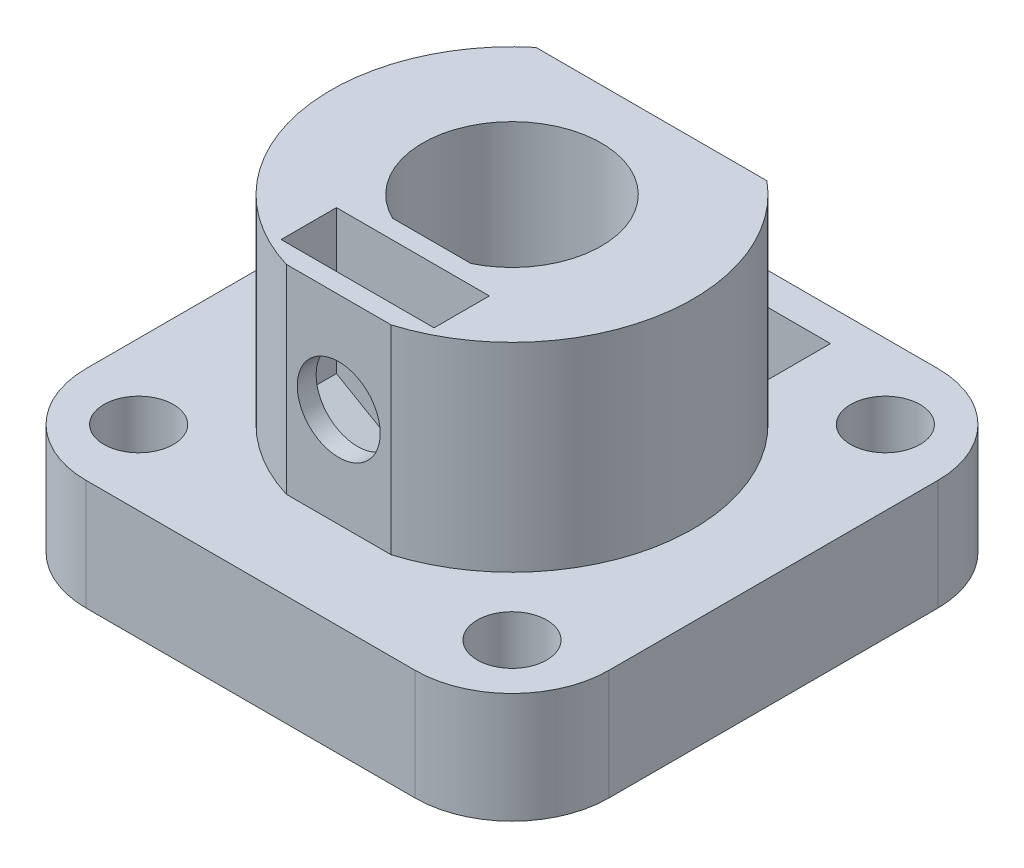
ISO-10303-21;
HEADER;
FILE_DESCRIPTION(('STEP AP214'),'2;1');
FILE_NAME('part.step','',(''),(''),'','','');
FILE_SCHEMA(('AUTOMOTIVE_DESIGN { 1 0 10303 214 1 1 1 1 }'));
ENDSEC;
DATA;
#1=APPLICATION_CONTEXT('core data for automotive mechanical design processes');
#2=APPLICATION_PROTOCOL_DEFINITION('international standard','automotive_design',2000,#1);
#3=PRODUCT_CONTEXT('',#1,'mechanical');
#4=PRODUCT('Part','Part','',(#3));
#5=PRODUCT_RELATED_PRODUCT_CATEGORY('part','',(#4));
#6=PRODUCT_DEFINITION_FORMATION('','',#4);
#7=PRODUCT_DEFINITION_CONTEXT('part definition',#1,'design');
#8=PRODUCT_DEFINITION('design','',#6,#7);
#9=PRODUCT_DEFINITION_SHAPE('','',#8);
#10=(LENGTH_UNIT() NAMED_UNIT(*) SI_UNIT(.MILLI.,.METRE.));
#11=(NAMED_UNIT(*) PLANE_ANGLE_UNIT() SI_UNIT($,.RADIAN.));
#12=(NAMED_UNIT(*) SI_UNIT($,.STERADIAN.) SOLID_ANGLE_UNIT());
#13=UNCERTAINTY_MEASURE_WITH_UNIT(LENGTH_MEASURE(1.E-05),#10,'distance_accuracy_value','');
#14=(GEOMETRIC_REPRESENTATION_CONTEXT(3) GLOBAL_UNCERTAINTY_ASSIGNED_CONTEXT((#13)) GLOBAL_UNIT_ASSIGNED_CONTEXT((#10,
#11,#12)) REPRESENTATION_CONTEXT('',''));
#15=CARTESIAN_POINT('',(0.,0.,0.));
#16=DIRECTION('',(0.,0.,1.));
#17=DIRECTION('',(1.,0.,0.));
#18=AXIS2_PLACEMENT_3D('',#15,#16,#17);
#19=CARTESIAN_POINT('',(0.,11.2,0.));
#20=DIRECTION('',(0.,-1.,0.));
#21=DIRECTION('',(0.,0.,-1.));
#22=AXIS2_PLACEMENT_3D('',#19,#20,#21);
#23=CYLINDRICAL_SURFACE('',#22,6.54594154601839);
#24=CARTESIAN_POINT('',(0.,4.,0.));
#25=DIRECTION('',(0.,1.,0.));
#26=DIRECTION('',(0.,0.,1.));
#27=AXIS2_PLACEMENT_3D('',#24,#25,#26);
#28=CIRCLE('',#27,6.54594154601839);
#29=CARTESIAN_POINT('',(1.89565101016254,4.,6.26544954265529));
#30=VERTEX_POINT('',#29);
#31=CARTESIAN_POINT('',(4.17587152302412,4.,-5.04097686436725));
#32=VERTEX_POINT('',#31);
#33=EDGE_CURVE('E384',#30,#32,#28,.T.);
#34=ORIENTED_EDGE('',*,*,#33,.T.);
#35=DIRECTION('',(0.,1.,0.));
#36=VECTOR('',#35,1.);
#37=CARTESIAN_POINT('',(4.17587152302412,-4.58787586701248,-5.04097686436725));
#38=LINE('',#37,#36);
#39=CARTESIAN_POINT('',(4.17587152302412,11.2,-5.04097686436725));
#40=VERTEX_POINT('',#39);
#41=EDGE_CURVE('E232',#32,#40,#38,.T.);
#42=ORIENTED_EDGE('',*,*,#41,.T.);
#43=CARTESIAN_POINT('',(0.,11.2,0.));
#44=DIRECTION('',(0.,1.,0.));
#45=DIRECTION('',(0.,0.,1.));
#46=AXIS2_PLACEMENT_3D('',#43,#44,#45);
#47=CIRCLE('',#46,6.54594154601839);
#48=CARTESIAN_POINT('',(1.89565101016254,11.2,6.26544954265529));
#49=VERTEX_POINT('',#48);
#50=EDGE_CURVE('E377',#49,#40,#47,.T.);
#51=ORIENTED_EDGE('',*,*,#50,.F.);
#52=DIRECTION('',(0.,-1.,0.));
#53=VECTOR('',#52,1.);
#54=CARTESIAN_POINT('',(1.89565101016254,11.2,6.26544954265529));
#55=LINE('',#54,#53);
#56=EDGE_CURVE('E392',#49,#30,#55,.T.);
#57=ORIENTED_EDGE('',*,*,#56,.T.);
#58=EDGE_LOOP('',(#34,#42,#51,#57));
#59=FACE_BOUND('',#58,.T.);
#60=ADVANCED_FACE('F39',(#59),#23,.T.);
#61=CARTESIAN_POINT('',(0.,7.6,-0.934550457344709));
#62=DIRECTION('',(0.,0.,1.));
#63=DIRECTION('',(1.,0.,0.));
#64=AXIS2_PLACEMENT_3D('',#61,#62,#63);
#65=CYLINDRICAL_SURFACE('',#64,1.5);
#66=CARTESIAN_POINT('',(0.,7.6,6.26544954265529));
#67=DIRECTION('',(0.,0.,1.));
#68=DIRECTION('',(1.,0.,0.));
#69=AXIS2_PLACEMENT_3D('',#66,#67,#68);
#70=CIRCLE('',#69,1.5);
#71=CARTESIAN_POINT('',(1.5,7.6,6.26544954265529));
#72=VERTEX_POINT('',#71);
#73=EDGE_CURVE('E303',#72,#72,#70,.T.);
#74=ORIENTED_EDGE('',*,*,#73,.T.);
#75=EDGE_LOOP('',(#74));
#76=FACE_BOUND('',#75,.T.);
#77=CARTESIAN_POINT('',(0.,7.6,5.58328500792591));
#78=DIRECTION('',(0.,0.,-1.));
#79=DIRECTION('',(-1.,0.,0.));
#80=AXIS2_PLACEMENT_3D('',#77,#78,#79);
#81=CIRCLE('',#80,1.5);
#82=CARTESIAN_POINT('',(-1.5,7.6,5.58328500792591));
#83=VERTEX_POINT('',#82);
#84=EDGE_CURVE('E294',#83,#83,#81,.F.);
#85=ORIENTED_EDGE('',*,*,#84,.F.);
#86=EDGE_LOOP('',(#85));
#87=FACE_BOUND('',#86,.T.);
#88=ADVANCED_FACE('F333',(#76,#87),#65,.F.);
#89=CARTESIAN_POINT('',(1.42,11.2,2.90112047319652));
#90=DIRECTION('',(0.,0.,-1.));
#91=DIRECTION('',(-1.,0.,0.));
#92=AXIS2_PLACEMENT_3D('',#89,#90,#91);
#93=PLANE('',#92);
#94=CARTESIAN_POINT('',(0.,7.6,2.90112047319652));
#95=DIRECTION('',(0.,0.,-1.));
#96=DIRECTION('',(-1.,0.,0.));
#97=AXIS2_PLACEMENT_3D('',#94,#95,#96);
#98=CIRCLE('',#97,1.5);
#99=CARTESIAN_POINT('',(-1.42,8.08332183894379,2.90112047319652));
#100=VERTEX_POINT('',#99);
#101=CARTESIAN_POINT('',(1.42,8.08332183894378,2.90112047319652));
#102=VERTEX_POINT('',#101);
#103=EDGE_CURVE('E520',#100,#102,#98,.T.);
#104=ORIENTED_EDGE('',*,*,#103,.F.);
#105=DIRECTION('',(0.,-1.,0.));
#106=VECTOR('',#105,1.);
#107=CARTESIAN_POINT('',(-1.42,11.2,2.90112047319652));
#108=LINE('',#107,#106);
#109=CARTESIAN_POINT('',(-1.42,11.2,2.90112047319652));
#110=VERTEX_POINT('',#109);
#111=EDGE_CURVE('E388',#110,#100,#108,.T.);
#112=ORIENTED_EDGE('',*,*,#111,.F.);
#113=DIRECTION('',(1.,0.,0.));
#114=VECTOR('',#113,1.);
#115=CARTESIAN_POINT('',(1.42,11.2,2.90112047319652));
#116=LINE('',#115,#114);
#117=CARTESIAN_POINT('',(1.42,11.2,2.90112047319652));
#118=VERTEX_POINT('',#117);
#119=EDGE_CURVE('E547',#110,#118,#116,.T.);
#120=ORIENTED_EDGE('',*,*,#119,.T.);
#121=DIRECTION('',(0.,-1.,0.));
#122=VECTOR('',#121,1.);
#123=CARTESIAN_POINT('',(1.42,11.2,2.90112047319652));
#124=LINE('',#123,#122);
#125=EDGE_CURVE('E541',#118,#102,#124,.T.);
#126=ORIENTED_EDGE('',*,*,#125,.T.);
#127=EDGE_LOOP('',(#104,#112,#120,#126));
#128=FACE_BOUND('',#127,.T.);
#129=ADVANCED_FACE('F339',(#128),#93,.T.);
#130=CARTESIAN_POINT('',(0.,4.,0.));
#131=DIRECTION('',(0.,1.,0.));
#132=DIRECTION('',(0.,0.,1.));
#133=AXIS2_PLACEMENT_3D('',#130,#131,#132);
#134=PLANE('',#133);
#135=DIRECTION('',(0.,0.,1.));
#136=VECTOR('',#135,1.);
#137=CARTESIAN_POINT('',(-2.77599439240195,4.,-5.04097686436725));
#138=LINE('',#137,#136);
#139=CARTESIAN_POINT('',(-2.77599439240195,4.,-8.29166349471677));
#140=VERTEX_POINT('',#139);
#141=CARTESIAN_POINT('',(-2.77599439240195,4.,-5.04097686436725));
#142=VERTEX_POINT('',#141);
#143=EDGE_CURVE('E63',#140,#142,#138,.T.);
#144=ORIENTED_EDGE('',*,*,#143,.F.);
#145=DIRECTION('',(-1.,0.,0.));
#146=VECTOR('',#145,1.);
#147=CARTESIAN_POINT('',(-2.77599439240195,4.,-8.29166349471677));
#148=LINE('',#147,#146);
#149=CARTESIAN_POINT('',(3.22534198532409,4.,-8.29166349471677));
#150=VERTEX_POINT('',#149);
#151=EDGE_CURVE('E227',#150,#140,#148,.T.);
#152=ORIENTED_EDGE('',*,*,#151,.F.);
#153=DIRECTION('',(0.,0.,-1.));
#154=VECTOR('',#153,1.);
#155=CARTESIAN_POINT('',(3.22534198532409,4.,-5.04097686436725));
#156=LINE('',#155,#154);
#157=CARTESIAN_POINT('',(3.22534198532409,4.,-5.04097686436725));
#158=VERTEX_POINT('',#157);
#159=EDGE_CURVE('E210',#158,#150,#156,.T.);
#160=ORIENTED_EDGE('',*,*,#159,.F.);
#161=DIRECTION('',(-1.,0.,0.));
#162=VECTOR('',#161,1.);
#163=CARTESIAN_POINT('',(4.17587152302412,4.,-5.04097686436725));
#164=LINE('',#163,#162);
#165=EDGE_CURVE('E224',#32,#158,#164,.T.);
#166=ORIENTED_EDGE('',*,*,#165,.F.);
#167=ORIENTED_EDGE('',*,*,#33,.F.);
#168=DIRECTION('',(1.,0.,0.));
#169=VECTOR('',#168,1.);
#170=CARTESIAN_POINT('',(1.89565101016254,4.,6.26544954265529));
#171=LINE('',#170,#169);
#172=CARTESIAN_POINT('',(-1.89565101016254,4.,6.26544954265529));
#173=VERTEX_POINT('',#172);
#174=EDGE_CURVE('E378',#173,#30,#171,.T.);
#175=ORIENTED_EDGE('',*,*,#174,.F.);
#176=CARTESIAN_POINT('',(-4.17587152302412,4.,-5.04097686436725));
#177=VERTEX_POINT('',#176);
#178=EDGE_CURVE('E394',#177,#173,#28,.T.);
#179=ORIENTED_EDGE('',*,*,#178,.F.);
#180=EDGE_CURVE('E235',#142,#177,#164,.T.);
#181=ORIENTED_EDGE('',*,*,#180,.F.);
#182=EDGE_LOOP('',(#144,#152,#160,#166,#167,#175,#179,#181));
#183=FACE_BOUND('',#182,.T.);
#184=DIRECTION('',(0.,0.,-1.));
#185=VECTOR('',#184,1.);
#186=CARTESIAN_POINT('',(9.45,4.,0.));
#187=LINE('',#186,#185);
#188=CARTESIAN_POINT('',(9.45,4.,5.95));
#189=VERTEX_POINT('',#188);
#190=CARTESIAN_POINT('',(9.45,4.,-5.95));
#191=VERTEX_POINT('',#190);
#192=EDGE_CURVE('E423',#189,#191,#187,.T.);
#193=ORIENTED_EDGE('',*,*,#192,.T.);
#194=CARTESIAN_POINT('',(5.95,4.,-5.95));
#195=DIRECTION('',(0.,1.,0.));
#196=DIRECTION('',(0.,0.,1.));
#197=AXIS2_PLACEMENT_3D('',#194,#195,#196);
#198=CIRCLE('',#197,3.5);
#199=CARTESIAN_POINT('',(5.95,4.,-9.45));
#200=VERTEX_POINT('',#199);
#201=EDGE_CURVE('E500',#191,#200,#198,.T.);
#202=ORIENTED_EDGE('',*,*,#201,.T.);
#203=DIRECTION('',(1.,0.,0.));
#204=VECTOR('',#203,1.);
#205=CARTESIAN_POINT('',(0.,4.,-9.45));
#206=LINE('',#205,#204);
#207=CARTESIAN_POINT('',(-5.95,4.,-9.45));
#208=VERTEX_POINT('',#207);
#209=EDGE_CURVE('E427',#208,#200,#206,.T.);
#210=ORIENTED_EDGE('',*,*,#209,.F.);
#211=CARTESIAN_POINT('',(-5.95,4.,-5.95));
#212=DIRECTION('',(0.,1.,0.));
#213=DIRECTION('',(0.,0.,1.));
#214=AXIS2_PLACEMENT_3D('',#211,#212,#213);
#215=CIRCLE('',#214,3.5);
#216=CARTESIAN_POINT('',(-9.45,4.,-5.95));
#217=VERTEX_POINT('',#216);
#218=EDGE_CURVE('E491',#208,#217,#215,.T.);
#219=ORIENTED_EDGE('',*,*,#218,.T.);
#220=DIRECTION('',(0.,0.,-1.));
#221=VECTOR('',#220,1.);
#222=CARTESIAN_POINT('',(-9.45,4.,0.));
#223=LINE('',#222,#221);
#224=CARTESIAN_POINT('',(-9.45,4.,5.95));
#225=VERTEX_POINT('',#224);
#226=EDGE_CURVE('E431',#225,#217,#223,.T.);
#227=ORIENTED_EDGE('',*,*,#226,.F.);
#228=CARTESIAN_POINT('',(-5.95,4.,5.95));
#229=DIRECTION('',(0.,1.,0.));
#230=DIRECTION('',(0.,0.,1.));
#231=AXIS2_PLACEMENT_3D('',#228,#229,#230);
#232=CIRCLE('',#231,3.5);
#233=CARTESIAN_POINT('',(-5.95,4.,9.45));
#234=VERTEX_POINT('',#233);
#235=EDGE_CURVE('E494',#225,#234,#232,.T.);
#236=ORIENTED_EDGE('',*,*,#235,.T.);
#237=DIRECTION('',(1.,0.,0.));
#238=VECTOR('',#237,1.);
#239=CARTESIAN_POINT('',(0.,4.,9.45));
#240=LINE('',#239,#238);
#241=CARTESIAN_POINT('',(5.95,4.,9.45));
#242=VERTEX_POINT('',#241);
#243=EDGE_CURVE('E419',#234,#242,#240,.T.);
#244=ORIENTED_EDGE('',*,*,#243,.T.);
#245=CARTESIAN_POINT('',(5.95,4.,5.95));
#246=DIRECTION('',(0.,1.,0.));
#247=DIRECTION('',(0.,0.,1.));
#248=AXIS2_PLACEMENT_3D('',#245,#246,#247);
#249=CIRCLE('',#248,3.5);
#250=EDGE_CURVE('E497',#242,#189,#249,.T.);
#251=ORIENTED_EDGE('',*,*,#250,.T.);
#252=EDGE_LOOP('',(#193,#202,#210,#219,#227,#236,#244,#251));
#253=FACE_BOUND('',#252,.T.);
#254=CARTESIAN_POINT('',(6.75,4.,6.75));
#255=DIRECTION('',(0.,1.,0.));
#256=DIRECTION('',(0.,0.,1.));
#257=AXIS2_PLACEMENT_3D('',#254,#255,#256);
#258=CIRCLE('',#257,1.25514787833992);
#259=CARTESIAN_POINT('',(6.75,4.,8.00514787833992));
#260=VERTEX_POINT('',#259);
#261=EDGE_CURVE('E415',#260,#260,#258,.T.);
#262=ORIENTED_EDGE('',*,*,#261,.F.);
#263=EDGE_LOOP('',(#262));
#264=FACE_BOUND('',#263,.T.);
#265=CARTESIAN_POINT('',(-6.75,4.,6.75));
#266=DIRECTION('',(0.,1.,0.));
#267=DIRECTION('',(0.,0.,1.));
#268=AXIS2_PLACEMENT_3D('',#265,#266,#267);
#269=CIRCLE('',#268,1.25514787833992);
#270=CARTESIAN_POINT('',(-6.75,4.,8.00514787833992));
#271=VERTEX_POINT('',#270);
#272=EDGE_CURVE('E411',#271,#271,#269,.T.);
#273=ORIENTED_EDGE('',*,*,#272,.F.);
#274=EDGE_LOOP('',(#273));
#275=FACE_BOUND('',#274,.T.);
#276=CARTESIAN_POINT('',(6.75,4.,-6.75));
#277=DIRECTION('',(0.,1.,0.));
#278=DIRECTION('',(0.,0.,1.));
#279=AXIS2_PLACEMENT_3D('',#276,#277,#278);
#280=CIRCLE('',#279,1.25514787833992);
#281=CARTESIAN_POINT('',(6.75,4.,-5.49485212166008));
#282=VERTEX_POINT('',#281);
#283=EDGE_CURVE('E406',#282,#282,#280,.T.);
#284=ORIENTED_EDGE('',*,*,#283,.F.);
#285=EDGE_LOOP('',(#284));
#286=FACE_BOUND('',#285,.T.);
#287=CARTESIAN_POINT('',(-6.75,4.,-6.75));
#288=DIRECTION('',(0.,1.,0.));
#289=DIRECTION('',(0.,0.,1.));
#290=AXIS2_PLACEMENT_3D('',#287,#288,#289);
#291=CIRCLE('',#290,1.25514787833992);
#292=CARTESIAN_POINT('',(-6.75,4.,-5.49485212166008));
#293=VERTEX_POINT('',#292);
#294=EDGE_CURVE('E402',#293,#293,#291,.T.);
#295=ORIENTED_EDGE('',*,*,#294,.F.);
#296=EDGE_LOOP('',(#295));
#297=FACE_BOUND('',#296,.T.);
#298=ADVANCED_FACE('F221',(#183,#253,#264,#275,#286,#297),#134,.T.);
#299=CARTESIAN_POINT('',(0.,4.,9.45));
#300=DIRECTION('',(0.,0.,-1.));
#301=DIRECTION('',(-1.,0.,0.));
#302=AXIS2_PLACEMENT_3D('',#299,#300,#301);
#303=PLANE('',#302);
#304=DIRECTION('',(1.,0.,0.));
#305=VECTOR('',#304,1.);
#306=CARTESIAN_POINT('',(0.,0.,9.45));
#307=LINE('',#306,#305);
#308=CARTESIAN_POINT('',(-5.95,0.,9.45));
#309=VERTEX_POINT('',#308);
#310=CARTESIAN_POINT('',(5.95,0.,9.45));
#311=VERTEX_POINT('',#310);
#312=EDGE_CURVE('E451',#309,#311,#307,.T.);
#313=ORIENTED_EDGE('',*,*,#312,.T.);
#314=DIRECTION('',(0.,-1.,0.));
#315=VECTOR('',#314,1.);
#316=CARTESIAN_POINT('',(5.95,4.,9.45));
#317=LINE('',#316,#315);
#318=EDGE_CURVE('E507',#311,#242,#317,.F.);
#319=ORIENTED_EDGE('',*,*,#318,.T.);
#320=ORIENTED_EDGE('',*,*,#243,.F.);
#321=DIRECTION('',(0.,-1.,0.));
#322=VECTOR('',#321,1.);
#323=CARTESIAN_POINT('',(-5.95,0.,9.45));
#324=LINE('',#323,#322);
#325=EDGE_CURVE('E503',#234,#309,#324,.T.);
#326=ORIENTED_EDGE('',*,*,#325,.T.);
#327=EDGE_LOOP('',(#313,#319,#320,#326));
#328=FACE_BOUND('',#327,.T.);
#329=ADVANCED_FACE('F754',(#328),#303,.F.);
#330=CARTESIAN_POINT('',(9.45,4.,0.));
#331=DIRECTION('',(-1.,0.,0.));
#332=DIRECTION('',(0.,0.,1.));
#333=AXIS2_PLACEMENT_3D('',#330,#331,#332);
#334=PLANE('',#333);
#335=DIRECTION('',(0.,0.,-1.));
#336=VECTOR('',#335,1.);
#337=CARTESIAN_POINT('',(9.45,0.,0.));
#338=LINE('',#337,#336);
#339=CARTESIAN_POINT('',(9.45,0.,5.95));
#340=VERTEX_POINT('',#339);
#341=CARTESIAN_POINT('',(9.45,0.,-5.95));
#342=VERTEX_POINT('',#341);
#343=EDGE_CURVE('E455',#340,#342,#338,.T.);
#344=ORIENTED_EDGE('',*,*,#343,.T.);
#345=DIRECTION('',(0.,-1.,0.));
#346=VECTOR('',#345,1.);
#347=CARTESIAN_POINT('',(9.45,4.,-5.95));
#348=LINE('',#347,#346);
#349=EDGE_CURVE('E488',#342,#191,#348,.F.);
#350=ORIENTED_EDGE('',*,*,#349,.T.);
#351=ORIENTED_EDGE('',*,*,#192,.F.);
#352=DIRECTION('',(0.,-1.,0.));
#353=VECTOR('',#352,1.);
#354=CARTESIAN_POINT('',(9.45,4.,5.95));
#355=LINE('',#354,#353);
#356=EDGE_CURVE('E484',#189,#340,#355,.T.);
#357=ORIENTED_EDGE('',*,*,#356,.T.);
#358=EDGE_LOOP('',(#344,#350,#351,#357));
#359=FACE_BOUND('',#358,.T.);
#360=ADVANCED_FACE('F742',(#359),#334,.F.);
#361=CARTESIAN_POINT('',(0.,4.,-9.45));
#362=DIRECTION('',(0.,0.,-1.));
#363=DIRECTION('',(-1.,0.,0.));
#364=AXIS2_PLACEMENT_3D('',#361,#362,#363);
#365=PLANE('',#364);
#366=ORIENTED_EDGE('',*,*,#209,.T.);
#367=DIRECTION('',(0.,-1.,0.));
#368=VECTOR('',#367,1.);
#369=CARTESIAN_POINT('',(5.95,0.,-9.45));
#370=LINE('',#369,#368);
#371=CARTESIAN_POINT('',(5.95,0.,-9.45));
#372=VERTEX_POINT('',#371);
#373=EDGE_CURVE('E468',#200,#372,#370,.T.);
#374=ORIENTED_EDGE('',*,*,#373,.T.);
#375=DIRECTION('',(1.,0.,0.));
#376=VECTOR('',#375,1.);
#377=CARTESIAN_POINT('',(0.,0.,-9.45));
#378=LINE('',#377,#376);
#379=CARTESIAN_POINT('',(-5.95,0.,-9.45));
#380=VERTEX_POINT('',#379);
#381=EDGE_CURVE('E459',#380,#372,#378,.T.);
#382=ORIENTED_EDGE('',*,*,#381,.F.);
#383=DIRECTION('',(0.,-1.,0.));
#384=VECTOR('',#383,1.);
#385=CARTESIAN_POINT('',(-5.95,4.,-9.45));
#386=LINE('',#385,#384);
#387=EDGE_CURVE('E435',#380,#208,#386,.F.);
#388=ORIENTED_EDGE('',*,*,#387,.T.);
#389=EDGE_LOOP('',(#366,#374,#382,#388));
#390=FACE_BOUND('',#389,.T.);
#391=ADVANCED_FACE('F736',(#390),#365,.T.);
#392=CARTESIAN_POINT('',(6.75,4.,6.75));
#393=DIRECTION('',(0.,-1.,0.));
#394=DIRECTION('',(0.,0.,-1.));
#395=AXIS2_PLACEMENT_3D('',#392,#393,#394);
#396=CYLINDRICAL_SURFACE('',#395,1.25514787833992);
#397=ORIENTED_EDGE('',*,*,#261,.T.);
#398=EDGE_LOOP('',(#397));
#399=FACE_BOUND('',#398,.T.);
#400=CARTESIAN_POINT('',(6.75,0.,6.75));
#401=DIRECTION('',(0.,1.,0.));
#402=DIRECTION('',(0.,0.,1.));
#403=AXIS2_PLACEMENT_3D('',#400,#401,#402);
#404=CIRCLE('',#403,1.25514787833992);
#405=CARTESIAN_POINT('',(6.75,0.,8.00514787833992));
#406=VERTEX_POINT('',#405);
#407=EDGE_CURVE('E447',#406,#406,#404,.T.);
#408=ORIENTED_EDGE('',*,*,#407,.F.);
#409=EDGE_LOOP('',(#408));
#410=FACE_BOUND('',#409,.T.);
#411=ADVANCED_FACE('F741',(#399,#410),#396,.F.);
#412=CARTESIAN_POINT('',(-6.75,4.,6.75));
#413=DIRECTION('',(0.,-1.,0.));
#414=DIRECTION('',(0.,0.,-1.));
#415=AXIS2_PLACEMENT_3D('',#412,#413,#414);
#416=CYLINDRICAL_SURFACE('',#415,1.25514787833992);
#417=ORIENTED_EDGE('',*,*,#272,.T.);
#418=EDGE_LOOP('',(#417));
#419=FACE_BOUND('',#418,.T.);
#420=CARTESIAN_POINT('',(-6.75,0.,6.75));
#421=DIRECTION('',(0.,1.,0.));
#422=DIRECTION('',(0.,0.,1.));
#423=AXIS2_PLACEMENT_3D('',#420,#421,#422);
#424=CIRCLE('',#423,1.25514787833992);
#425=CARTESIAN_POINT('',(-6.75,0.,8.00514787833992));
#426=VERTEX_POINT('',#425);
#427=EDGE_CURVE('E443',#426,#426,#424,.T.);
#428=ORIENTED_EDGE('',*,*,#427,.F.);
#429=EDGE_LOOP('',(#428));
#430=FACE_BOUND('',#429,.T.);
#431=ADVANCED_FACE('F781',(#419,#430),#416,.F.);
#432=CARTESIAN_POINT('',(6.75,4.,-6.75));
#433=DIRECTION('',(0.,-1.,0.));
#434=DIRECTION('',(0.,0.,-1.));
#435=AXIS2_PLACEMENT_3D('',#432,#433,#434);
#436=CYLINDRICAL_SURFACE('',#435,1.25514787833992);
#437=ORIENTED_EDGE('',*,*,#283,.T.);
#438=EDGE_LOOP('',(#437));
#439=FACE_BOUND('',#438,.T.);
#440=CARTESIAN_POINT('',(6.75,0.,-6.75));
#441=DIRECTION('',(0.,1.,0.));
#442=DIRECTION('',(0.,0.,1.));
#443=AXIS2_PLACEMENT_3D('',#440,#441,#442);
#444=CIRCLE('',#443,1.25514787833992);
#445=CARTESIAN_POINT('',(6.75,0.,-5.49485212166008));
#446=VERTEX_POINT('',#445);
#447=EDGE_CURVE('E439',#446,#446,#444,.T.);
#448=ORIENTED_EDGE('',*,*,#447,.F.);
#449=EDGE_LOOP('',(#448));
#450=FACE_BOUND('',#449,.T.);
#451=ADVANCED_FACE('F771',(#439,#450),#436,.F.);
#452=CARTESIAN_POINT('',(-6.75,4.,-6.75));
#453=DIRECTION('',(0.,-1.,0.));
#454=DIRECTION('',(0.,0.,-1.));
#455=AXIS2_PLACEMENT_3D('',#452,#453,#454);
#456=CYLINDRICAL_SURFACE('',#455,1.25514787833992);
#457=ORIENTED_EDGE('',*,*,#294,.T.);
#458=EDGE_LOOP('',(#457));
#459=FACE_BOUND('',#458,.T.);
#460=CARTESIAN_POINT('',(-6.75,0.,-6.75));
#461=DIRECTION('',(0.,1.,0.));
#462=DIRECTION('',(0.,0.,1.));
#463=AXIS2_PLACEMENT_3D('',#460,#461,#462);
#464=CIRCLE('',#463,1.25514787833992);
#465=CARTESIAN_POINT('',(-6.75,0.,-5.49485212166008));
#466=VERTEX_POINT('',#465);
#467=EDGE_CURVE('E401',#466,#466,#464,.T.);
#468=ORIENTED_EDGE('',*,*,#467,.F.);
#469=EDGE_LOOP('',(#468));
#470=FACE_BOUND('',#469,.T.);
#471=ADVANCED_FACE('F727',(#459,#470),#456,.F.);
#472=CARTESIAN_POINT('',(-9.45,4.,0.));
#473=DIRECTION('',(-1.,0.,0.));
#474=DIRECTION('',(0.,0.,1.));
#475=AXIS2_PLACEMENT_3D('',#472,#473,#474);
#476=PLANE('',#475);
#477=DIRECTION('',(0.,0.,-1.));
#478=VECTOR('',#477,1.);
#479=CARTESIAN_POINT('',(-9.45,0.,0.));
#480=LINE('',#479,#478);
#481=CARTESIAN_POINT('',(-9.45,0.,5.95));
#482=VERTEX_POINT('',#481);
#483=CARTESIAN_POINT('',(-9.45,0.,-5.95));
#484=VERTEX_POINT('',#483);
#485=EDGE_CURVE('E407',#482,#484,#480,.T.);
#486=ORIENTED_EDGE('',*,*,#485,.F.);
#487=DIRECTION('',(0.,-1.,0.));
#488=VECTOR('',#487,1.);
#489=CARTESIAN_POINT('',(-9.45,4.,5.95));
#490=LINE('',#489,#488);
#491=EDGE_CURVE('E514',#482,#225,#490,.F.);
#492=ORIENTED_EDGE('',*,*,#491,.T.);
#493=ORIENTED_EDGE('',*,*,#226,.T.);
#494=DIRECTION('',(0.,-1.,0.));
#495=VECTOR('',#494,1.);
#496=CARTESIAN_POINT('',(-9.45,4.,-5.95));
#497=LINE('',#496,#495);
#498=EDGE_CURVE('E510',#217,#484,#497,.T.);
#499=ORIENTED_EDGE('',*,*,#498,.T.);
#500=EDGE_LOOP('',(#486,#492,#493,#499));
#501=FACE_BOUND('',#500,.T.);
#502=ADVANCED_FACE('F722',(#501),#476,.T.);
#503=CARTESIAN_POINT('',(0.,0.,0.));
#504=DIRECTION('',(0.,1.,0.));
#505=DIRECTION('',(0.,0.,1.));
#506=AXIS2_PLACEMENT_3D('',#503,#504,#505);
#507=PLANE('',#506);
#508=DIRECTION('',(1.,0.,0.));
#509=VECTOR('',#508,1.);
#510=CARTESIAN_POINT('',(-2.77599439240195,0.,-8.29166349471677));
#511=LINE('',#510,#509);
#512=CARTESIAN_POINT('',(-2.77599439240195,0.,-8.29166349471677));
#513=VERTEX_POINT('',#512);
#514=CARTESIAN_POINT('',(3.22534198532409,0.,-8.29166349471677));
#515=VERTEX_POINT('',#514);
#516=EDGE_CURVE('E579',#513,#515,#511,.T.);
#517=ORIENTED_EDGE('',*,*,#516,.F.);
#518=DIRECTION('',(0.,0.,-1.));
#519=VECTOR('',#518,1.);
#520=CARTESIAN_POINT('',(-2.77599439240195,0.,-5.04097686436725));
#521=LINE('',#520,#519);
#522=CARTESIAN_POINT('',(-2.77599439240195,0.,-5.04097686436725));
#523=VERTEX_POINT('',#522);
#524=EDGE_CURVE('E567',#523,#513,#521,.T.);
#525=ORIENTED_EDGE('',*,*,#524,.F.);
#526=DIRECTION('',(-1.,0.,0.));
#527=VECTOR('',#526,1.);
#528=CARTESIAN_POINT('',(-2.77599439240195,0.,-5.04097686436725));
#529=LINE('',#528,#527);
#530=CARTESIAN_POINT('',(3.22534198532409,0.,-5.04097686436725));
#531=VERTEX_POINT('',#530);
#532=EDGE_CURVE('E244',#531,#523,#529,.T.);
#533=ORIENTED_EDGE('',*,*,#532,.F.);
#534=DIRECTION('',(0.,0.,1.));
#535=VECTOR('',#534,1.);
#536=CARTESIAN_POINT('',(3.22534198532409,0.,-5.04097686436725));
#537=LINE('',#536,#535);
#538=EDGE_CURVE('E213',#515,#531,#537,.T.);
#539=ORIENTED_EDGE('',*,*,#538,.F.);
#540=EDGE_LOOP('',(#517,#525,#533,#539));
#541=FACE_BOUND('',#540,.T.);
#542=DIRECTION('',(-1.,0.,0.));
#543=VECTOR('',#542,1.);
#544=CARTESIAN_POINT('',(-1.42,0.,2.90112047319652));
#545=LINE('',#544,#543);
#546=CARTESIAN_POINT('',(1.42,0.,2.90112047319652));
#547=VERTEX_POINT('',#546);
#548=CARTESIAN_POINT('',(-1.42,0.,2.90112047319652));
#549=VERTEX_POINT('',#548);
#550=EDGE_CURVE('E240',#547,#549,#545,.T.);
#551=ORIENTED_EDGE('',*,*,#550,.F.);
#552=CARTESIAN_POINT('',(0.,0.,0.));
#553=DIRECTION('',(0.,1.,0.));
#554=DIRECTION('',(0.,0.,1.));
#555=AXIS2_PLACEMENT_3D('',#552,#553,#554);
#556=CIRCLE('',#555,3.23);
#557=EDGE_CURVE('E234',#549,#547,#556,.F.);
#558=ORIENTED_EDGE('',*,*,#557,.F.);
#559=EDGE_LOOP('',(#551,#558));
#560=FACE_BOUND('',#559,.T.);
#561=ORIENTED_EDGE('',*,*,#467,.T.);
#562=EDGE_LOOP('',(#561));
#563=FACE_BOUND('',#562,.T.);
#564=ORIENTED_EDGE('',*,*,#447,.T.);
#565=EDGE_LOOP('',(#564));
#566=FACE_BOUND('',#565,.T.);
#567=ORIENTED_EDGE('',*,*,#427,.T.);
#568=EDGE_LOOP('',(#567));
#569=FACE_BOUND('',#568,.T.);
#570=ORIENTED_EDGE('',*,*,#407,.T.);
#571=EDGE_LOOP('',(#570));
#572=FACE_BOUND('',#571,.T.);
#573=ORIENTED_EDGE('',*,*,#381,.T.);
#574=CARTESIAN_POINT('',(5.95,0.,-5.95));
#575=DIRECTION('',(0.,1.,0.));
#576=DIRECTION('',(0.,0.,1.));
#577=AXIS2_PLACEMENT_3D('',#574,#575,#576);
#578=CIRCLE('',#577,3.5);
#579=EDGE_CURVE('E481',#372,#342,#578,.F.);
#580=ORIENTED_EDGE('',*,*,#579,.T.);
#581=ORIENTED_EDGE('',*,*,#343,.F.);
#582=CARTESIAN_POINT('',(5.95,0.,5.95));
#583=DIRECTION('',(0.,1.,0.));
#584=DIRECTION('',(0.,0.,1.));
#585=AXIS2_PLACEMENT_3D('',#582,#583,#584);
#586=CIRCLE('',#585,3.5);
#587=EDGE_CURVE('E478',#340,#311,#586,.F.);
#588=ORIENTED_EDGE('',*,*,#587,.T.);
#589=ORIENTED_EDGE('',*,*,#312,.F.);
#590=CARTESIAN_POINT('',(-5.95,0.,5.95));
#591=DIRECTION('',(0.,1.,0.));
#592=DIRECTION('',(0.,0.,1.));
#593=AXIS2_PLACEMENT_3D('',#590,#591,#592);
#594=CIRCLE('',#593,3.5);
#595=EDGE_CURVE('E475',#309,#482,#594,.F.);
#596=ORIENTED_EDGE('',*,*,#595,.T.);
#597=ORIENTED_EDGE('',*,*,#485,.T.);
#598=CARTESIAN_POINT('',(-5.95,0.,-5.95));
#599=DIRECTION('',(0.,1.,0.));
#600=DIRECTION('',(0.,0.,1.));
#601=AXIS2_PLACEMENT_3D('',#598,#599,#600);
#602=CIRCLE('',#601,3.5);
#603=EDGE_CURVE('E472',#484,#380,#602,.F.);
#604=ORIENTED_EDGE('',*,*,#603,.T.);
#605=EDGE_LOOP('',(#573,#580,#581,#588,#589,#596,#597,#604));
#606=FACE_BOUND('',#605,.T.);
#607=ADVANCED_FACE('F588',(#541,#560,#563,#566,#569,#572,#606),#507,.F.);
#608=CARTESIAN_POINT('',(5.95,4.,-5.95));
#609=DIRECTION('',(0.,1.,0.));
#610=DIRECTION('',(0.,0.,1.));
#611=AXIS2_PLACEMENT_3D('',#608,#609,#610);
#612=CYLINDRICAL_SURFACE('',#611,3.5);
#613=ORIENTED_EDGE('',*,*,#201,.F.);
#614=ORIENTED_EDGE('',*,*,#349,.F.);
#615=ORIENTED_EDGE('',*,*,#579,.F.);
#616=ORIENTED_EDGE('',*,*,#373,.F.);
#617=EDGE_LOOP('',(#613,#614,#615,#616));
#618=FACE_BOUND('',#617,.T.);
#619=ADVANCED_FACE('F705',(#618),#612,.T.);
#620=CARTESIAN_POINT('',(5.95,4.,5.95));
#621=DIRECTION('',(0.,-1.,0.));
#622=DIRECTION('',(0.,0.,-1.));
#623=AXIS2_PLACEMENT_3D('',#620,#621,#622);
#624=CYLINDRICAL_SURFACE('',#623,3.5);
#625=ORIENTED_EDGE('',*,*,#250,.F.);
#626=ORIENTED_EDGE('',*,*,#318,.F.);
#627=ORIENTED_EDGE('',*,*,#587,.F.);
#628=ORIENTED_EDGE('',*,*,#356,.F.);
#629=EDGE_LOOP('',(#625,#626,#627,#628));
#630=FACE_BOUND('',#629,.T.);
#631=ADVANCED_FACE('F696',(#630),#624,.T.);
#632=CARTESIAN_POINT('',(-5.95,4.,5.95));
#633=DIRECTION('',(0.,1.,0.));
#634=DIRECTION('',(0.,0.,1.));
#635=AXIS2_PLACEMENT_3D('',#632,#633,#634);
#636=CYLINDRICAL_SURFACE('',#635,3.5);
#637=ORIENTED_EDGE('',*,*,#235,.F.);
#638=ORIENTED_EDGE('',*,*,#491,.F.);
#639=ORIENTED_EDGE('',*,*,#595,.F.);
#640=ORIENTED_EDGE('',*,*,#325,.F.);
#641=EDGE_LOOP('',(#637,#638,#639,#640));
#642=FACE_BOUND('',#641,.T.);
#643=ADVANCED_FACE('F686',(#642),#636,.T.);
#644=CARTESIAN_POINT('',(-5.95,4.,-5.95));
#645=DIRECTION('',(0.,-1.,0.));
#646=DIRECTION('',(0.,0.,-1.));
#647=AXIS2_PLACEMENT_3D('',#644,#645,#646);
#648=CYLINDRICAL_SURFACE('',#647,3.5);
#649=ORIENTED_EDGE('',*,*,#218,.F.);
#650=ORIENTED_EDGE('',*,*,#387,.F.);
#651=ORIENTED_EDGE('',*,*,#603,.F.);
#652=ORIENTED_EDGE('',*,*,#498,.F.);
#653=EDGE_LOOP('',(#649,#650,#651,#652));
#654=FACE_BOUND('',#653,.T.);
#655=ADVANCED_FACE('F41',(#654),#648,.T.);
#656=CARTESIAN_POINT('',(0.,11.2,0.));
#657=DIRECTION('',(0.,1.,0.));
#658=DIRECTION('',(0.,0.,1.));
#659=AXIS2_PLACEMENT_3D('',#656,#657,#658);
#660=PLANE('',#659);
#661=DIRECTION('',(1.,0.,0.));
#662=VECTOR('',#661,1.);
#663=CARTESIAN_POINT('',(4.17587152302412,11.2,-5.04097686436725));
#664=LINE('',#663,#662);
#665=CARTESIAN_POINT('',(-4.17587152302412,11.2,-5.04097686436725));
#666=VERTEX_POINT('',#665);
#667=EDGE_CURVE('E246',#666,#40,#664,.T.);
#668=ORIENTED_EDGE('',*,*,#667,.F.);
#669=CARTESIAN_POINT('',(-1.89565101016254,11.2,6.26544954265529));
#670=VERTEX_POINT('',#669);
#671=EDGE_CURVE('E370',#666,#670,#47,.T.);
#672=ORIENTED_EDGE('',*,*,#671,.T.);
#673=DIRECTION('',(1.,0.,0.));
#674=VECTOR('',#673,1.);
#675=CARTESIAN_POINT('',(1.89565101016254,11.2,6.26544954265529));
#676=LINE('',#675,#674);
#677=EDGE_CURVE('E383',#670,#49,#676,.T.);
#678=ORIENTED_EDGE('',*,*,#677,.T.);
#679=ORIENTED_EDGE('',*,*,#50,.T.);
#680=EDGE_LOOP('',(#668,#672,#678,#679));
#681=FACE_BOUND('',#680,.T.);
#682=DIRECTION('',(-1.,0.,0.));
#683=VECTOR('',#682,1.);
#684=CARTESIAN_POINT('',(0.,11.2,3.5832850079259));
#685=LINE('',#684,#683);
#686=CARTESIAN_POINT('',(2.765,11.2,3.5832850079259));
#687=VERTEX_POINT('',#686);
#688=CARTESIAN_POINT('',(-2.765,11.2,3.5832850079259));
#689=VERTEX_POINT('',#688);
#690=EDGE_CURVE('E300',#687,#689,#685,.T.);
#691=ORIENTED_EDGE('',*,*,#690,.F.);
#692=DIRECTION('',(0.,0.,1.));
#693=VECTOR('',#692,1.);
#694=CARTESIAN_POINT('',(2.765,11.2,0.));
#695=LINE('',#694,#693);
#696=CARTESIAN_POINT('',(2.765,11.2,5.58328500792591));
#697=VERTEX_POINT('',#696);
#698=EDGE_CURVE('E11',#687,#697,#695,.T.);
#699=ORIENTED_EDGE('',*,*,#698,.T.);
#700=DIRECTION('',(-1.,0.,0.));
#701=VECTOR('',#700,1.);
#702=CARTESIAN_POINT('',(0.,11.2,5.58328500792591));
#703=LINE('',#702,#701);
#704=CARTESIAN_POINT('',(-2.765,11.2,5.58328500792591));
#705=VERTEX_POINT('',#704);
#706=EDGE_CURVE('E295',#697,#705,#703,.T.);
#707=ORIENTED_EDGE('',*,*,#706,.T.);
#708=DIRECTION('',(0.,0.,-1.));
#709=VECTOR('',#708,1.);
#710=CARTESIAN_POINT('',(-2.765,11.2,0.));
#711=LINE('',#710,#709);
#712=EDGE_CURVE('E48',#705,#689,#711,.T.);
#713=ORIENTED_EDGE('',*,*,#712,.T.);
#714=EDGE_LOOP('',(#691,#699,#707,#713));
#715=FACE_BOUND('',#714,.T.);
#716=ORIENTED_EDGE('',*,*,#119,.F.);
#717=CARTESIAN_POINT('',(0.,11.2,0.));
#718=DIRECTION('',(0.,1.,0.));
#719=DIRECTION('',(0.,0.,1.));
#720=AXIS2_PLACEMENT_3D('',#717,#718,#719);
#721=CIRCLE('',#720,3.23);
#722=EDGE_CURVE('E545',#118,#110,#721,.T.);
#723=ORIENTED_EDGE('',*,*,#722,.F.);
#724=EDGE_LOOP('',(#716,#723));
#725=FACE_BOUND('',#724,.T.);
#726=ADVANCED_FACE('F359',(#681,#715,#725),#660,.T.);
#727=ORIENTED_EDGE('',*,*,#671,.F.);
#728=DIRECTION('',(0.,1.,0.));
#729=VECTOR('',#728,1.);
#730=CARTESIAN_POINT('',(-4.17587152302412,-4.58787586701248,-5.04097686436725));
#731=LINE('',#730,#729);
#732=EDGE_CURVE('E249',#177,#666,#731,.T.);
#733=ORIENTED_EDGE('',*,*,#732,.F.);
#734=ORIENTED_EDGE('',*,*,#178,.T.);
#735=DIRECTION('',(0.,-1.,0.));
#736=VECTOR('',#735,1.);
#737=CARTESIAN_POINT('',(-1.89565101016254,11.2,6.26544954265529));
#738=LINE('',#737,#736);
#739=EDGE_CURVE('E373',#670,#173,#738,.T.);
#740=ORIENTED_EDGE('',*,*,#739,.F.);
#741=EDGE_LOOP('',(#727,#733,#734,#740));
#742=FACE_BOUND('',#741,.T.);
#743=ADVANCED_FACE('F351',(#742),#23,.T.);
#744=CARTESIAN_POINT('',(1.89565101016254,11.2,6.26544954265529));
#745=DIRECTION('',(0.,0.,-1.));
#746=DIRECTION('',(-1.,0.,0.));
#747=AXIS2_PLACEMENT_3D('',#744,#745,#746);
#748=PLANE('',#747);
#749=ORIENTED_EDGE('',*,*,#73,.F.);
#750=EDGE_LOOP('',(#749));
#751=FACE_BOUND('',#750,.T.);
#752=ORIENTED_EDGE('',*,*,#174,.T.);
#753=ORIENTED_EDGE('',*,*,#56,.F.);
#754=ORIENTED_EDGE('',*,*,#677,.F.);
#755=ORIENTED_EDGE('',*,*,#739,.T.);
#756=EDGE_LOOP('',(#752,#753,#754,#755));
#757=FACE_BOUND('',#756,.T.);
#758=ADVANCED_FACE('F343',(#751,#757),#748,.F.);
#759=CARTESIAN_POINT('',(0.,11.2,0.));
#760=DIRECTION('',(0.,-1.,0.));
#761=DIRECTION('',(0.,0.,-1.));
#762=AXIS2_PLACEMENT_3D('',#759,#760,#761);
#763=CYLINDRICAL_SURFACE('',#762,3.23);
#764=CARTESIAN_POINT('',(1.42,8.08332183894378,2.90112047319652));
#765=CARTESIAN_POINT('',(1.43213157948199,8.04767784330284,2.89518014795887));
#766=CARTESIAN_POINT('',(1.44294485785123,8.0115057343566,2.88979589573638));
#767=CARTESIAN_POINT('',(1.46184690708239,7.93828410565976,2.88028077762413));
#768=CARTESIAN_POINT('',(1.4699348253028,7.90123431519534,2.87615030402483));
#769=CARTESIAN_POINT('',(1.48995872824324,7.78912506087481,2.8658616381512));
#770=CARTESIAN_POINT('',(1.49767272519207,7.71305344498875,2.8617971684282));
#771=CARTESIAN_POINT('',(1.50142736113948,7.56042269251126,2.85982835786773));
#772=CARTESIAN_POINT('',(1.49744336419859,7.48386286634523,2.86193701759426));
#773=CARTESIAN_POINT('',(1.47796248945501,7.33278340148224,2.8720458916879));
#774=CARTESIAN_POINT('',(1.46249288307817,7.25825936287658,2.88003214989529));
#775=CARTESIAN_POINT('',(1.43498293652646,7.16248899663512,2.8937467810387));
#776=CARTESIAN_POINT('',(1.42776053543634,7.13946471681069,2.89731928530644));
#777=CARTESIAN_POINT('',(1.42,7.11667816105622,2.90112047319653));
#778=B_SPLINE_CURVE_WITH_KNOTS('',3,(#764,#765,#766,#767,#768,#769,#770,#771,#772,#773,#774,
#775,#776,#777),.UNSPECIFIED.,.F.,.F.,(4,2,2,2,2,2,4),(0.,0.114294203453261,0.22862413124871,
0.457118155592093,0.686093732564191,0.914527361759183,0.987669014984168),.UNSPECIFIED.);
#779=CARTESIAN_POINT('',(1.42,7.11667816105621,2.90112047319652));
#780=VERTEX_POINT('',#779);
#781=EDGE_CURVE('E316',#102,#780,#778,.T.);
#782=ORIENTED_EDGE('',*,*,#781,.F.);
#783=ORIENTED_EDGE('',*,*,#125,.F.);
#784=ORIENTED_EDGE('',*,*,#722,.T.);
#785=ORIENTED_EDGE('',*,*,#111,.T.);
#786=CARTESIAN_POINT('',(-1.42,7.11667816105621,2.90112047319652));
#787=CARTESIAN_POINT('',(-1.43213157948198,7.15232215669715,2.89518014795887));
#788=CARTESIAN_POINT('',(-1.44294485785123,7.1884942656434,2.88979589573638));
#789=CARTESIAN_POINT('',(-1.46184690708239,7.26171589434024,2.88028077762414));
#790=CARTESIAN_POINT('',(-1.46993482530279,7.29876568480465,2.87615030402483));
#791=CARTESIAN_POINT('',(-1.48995872824324,7.41087493912519,2.8658616381512));
#792=CARTESIAN_POINT('',(-1.49767272519207,7.48694655501125,2.8617971684282));
#793=CARTESIAN_POINT('',(-1.50142736113948,7.63957730748874,2.85982835786773));
#794=CARTESIAN_POINT('',(-1.49744336419859,7.71613713365477,2.86193701759426));
#795=CARTESIAN_POINT('',(-1.47796248945501,7.86721659851776,2.8720458916879));
#796=CARTESIAN_POINT('',(-1.46249288307817,7.94174063712342,2.88003214989529));
#797=CARTESIAN_POINT('',(-1.43498293652646,8.03751100336488,2.8937467810387));
#798=CARTESIAN_POINT('',(-1.42776053543633,8.06053528318932,2.89731928530644));
#799=CARTESIAN_POINT('',(-1.42,8.08332183894379,2.90112047319653));
#800=B_SPLINE_CURVE_WITH_KNOTS('',3,(#786,#787,#788,#789,#790,#791,#792,#793,#794,#795,#796,
#797,#798,#799),.UNSPECIFIED.,.F.,.F.,(4,2,2,2,2,2,4),(0.,0.114294203453261,0.228624131248709,
0.457118155592093,0.686093732564191,0.914527361759183,0.987669014984175),.UNSPECIFIED.);
#801=CARTESIAN_POINT('',(-1.42,7.11667816105622,2.90112047319652));
#802=VERTEX_POINT('',#801);
#803=EDGE_CURVE('E307',#802,#100,#800,.T.);
#804=ORIENTED_EDGE('',*,*,#803,.F.);
#805=EDGE_CURVE('E549',#802,#549,#108,.T.);
#806=ORIENTED_EDGE('',*,*,#805,.T.);
#807=ORIENTED_EDGE('',*,*,#557,.T.);
#808=EDGE_CURVE('E543',#780,#547,#124,.T.);
#809=ORIENTED_EDGE('',*,*,#808,.F.);
#810=EDGE_LOOP('',(#782,#783,#784,#785,#804,#806,#807,#809));
#811=FACE_BOUND('',#810,.T.);
#812=ADVANCED_FACE('F322',(#811),#763,.F.);
#813=EDGE_CURVE('E517',#780,#802,#98,.T.);
#814=ORIENTED_EDGE('',*,*,#813,.F.);
#815=ORIENTED_EDGE('',*,*,#808,.T.);
#816=ORIENTED_EDGE('',*,*,#550,.T.);
#817=ORIENTED_EDGE('',*,*,#805,.F.);
#818=EDGE_LOOP('',(#814,#815,#816,#817));
#819=FACE_BOUND('',#818,.T.);
#820=ADVANCED_FACE('F331',(#819),#93,.T.);
#821=CARTESIAN_POINT('',(0.,7.6,3.5832850079259));
#822=DIRECTION('',(0.,0.,-1.));
#823=DIRECTION('',(-1.,0.,0.));
#824=AXIS2_PLACEMENT_3D('',#821,#822,#823);
#825=CIRCLE('',#824,1.5);
#826=CARTESIAN_POINT('',(-1.5,7.6,3.5832850079259));
#827=VERTEX_POINT('',#826);
#828=EDGE_CURVE('E299',#827,#827,#825,.F.);
#829=ORIENTED_EDGE('',*,*,#828,.T.);
#830=EDGE_LOOP('',(#829));
#831=FACE_BOUND('',#830,.T.);
#832=ORIENTED_EDGE('',*,*,#103,.T.);
#833=ORIENTED_EDGE('',*,*,#781,.T.);
#834=ORIENTED_EDGE('',*,*,#813,.T.);
#835=ORIENTED_EDGE('',*,*,#803,.T.);
#836=EDGE_LOOP('',(#832,#833,#834,#835));
#837=FACE_BOUND('',#836,.T.);
#838=ADVANCED_FACE('F326',(#831,#837),#65,.F.);
#839=CARTESIAN_POINT('',(0.,0.,3.5832850079259));
#840=DIRECTION('',(0.,0.,-1.));
#841=DIRECTION('',(-1.,0.,0.));
#842=AXIS2_PLACEMENT_3D('',#839,#840,#841);
#843=PLANE('',#842);
#844=ORIENTED_EDGE('',*,*,#690,.T.);
#845=DIRECTION('',(0.,1.,0.));
#846=VECTOR('',#845,1.);
#847=CARTESIAN_POINT('',(-2.765,0.,3.5832850079259));
#848=LINE('',#847,#846);
#849=CARTESIAN_POINT('',(-2.765,6.00362650569068,3.5832850079259));
#850=VERTEX_POINT('',#849);
#851=EDGE_CURVE('E280',#850,#689,#848,.T.);
#852=ORIENTED_EDGE('',*,*,#851,.F.);
#853=DIRECTION('',(-0.866025403784439,0.5,0.));
#854=VECTOR('',#853,1.);
#855=CARTESIAN_POINT('',(1.90839653438087,3.30543975853602,3.5832850079259));
#856=LINE('',#855,#854);
#857=CARTESIAN_POINT('',(0.,4.40725301138137,3.5832850079259));
#858=VERTEX_POINT('',#857);
#859=EDGE_CURVE('E277',#858,#850,#856,.T.);
#860=ORIENTED_EDGE('',*,*,#859,.F.);
#861=DIRECTION('',(-0.866025403784439,-0.5,0.));
#862=VECTOR('',#861,1.);
#863=CARTESIAN_POINT('',(-1.90839653438087,3.30543975853602,3.5832850079259));
#864=LINE('',#863,#862);
#865=CARTESIAN_POINT('',(2.765,6.00362650569068,3.5832850079259));
#866=VERTEX_POINT('',#865);
#867=EDGE_CURVE('E274',#866,#858,#864,.T.);
#868=ORIENTED_EDGE('',*,*,#867,.F.);
#869=DIRECTION('',(0.,-1.,0.));
#870=VECTOR('',#869,1.);
#871=CARTESIAN_POINT('',(2.765,0.,3.5832850079259));
#872=LINE('',#871,#870);
#873=EDGE_CURVE('E271',#687,#866,#872,.T.);
#874=ORIENTED_EDGE('',*,*,#873,.F.);
#875=EDGE_LOOP('',(#844,#852,#860,#868,#874));
#876=FACE_BOUND('',#875,.T.);
#877=ORIENTED_EDGE('',*,*,#828,.F.);
#878=EDGE_LOOP('',(#877));
#879=FACE_BOUND('',#878,.T.);
#880=ADVANCED_FACE('F330',(#876,#879),#843,.F.);
#881=CARTESIAN_POINT('',(0.,0.,5.58328500792591));
#882=DIRECTION('',(0.,0.,-1.));
#883=DIRECTION('',(-1.,0.,0.));
#884=AXIS2_PLACEMENT_3D('',#881,#882,#883);
#885=PLANE('',#884);
#886=DIRECTION('',(0.,-1.,0.));
#887=VECTOR('',#886,1.);
#888=CARTESIAN_POINT('',(2.765,0.,5.58328500792591));
#889=LINE('',#888,#887);
#890=CARTESIAN_POINT('',(2.765,6.00362650569068,5.58328500792591));
#891=VERTEX_POINT('',#890);
#892=EDGE_CURVE('E257',#697,#891,#889,.T.);
#893=ORIENTED_EDGE('',*,*,#892,.T.);
#894=DIRECTION('',(-0.866025403784439,-0.5,0.));
#895=VECTOR('',#894,1.);
#896=CARTESIAN_POINT('',(-1.90839653438087,3.30543975853602,5.58328500792591));
#897=LINE('',#896,#895);
#898=CARTESIAN_POINT('',(0.,4.40725301138137,5.58328500792591));
#899=VERTEX_POINT('',#898);
#900=EDGE_CURVE('E260',#891,#899,#897,.T.);
#901=ORIENTED_EDGE('',*,*,#900,.T.);
#902=DIRECTION('',(-0.866025403784439,0.5,0.));
#903=VECTOR('',#902,1.);
#904=CARTESIAN_POINT('',(1.90839653438087,3.30543975853602,5.58328500792591));
#905=LINE('',#904,#903);
#906=CARTESIAN_POINT('',(-2.765,6.00362650569068,5.58328500792591));
#907=VERTEX_POINT('',#906);
#908=EDGE_CURVE('E264',#899,#907,#905,.T.);
#909=ORIENTED_EDGE('',*,*,#908,.T.);
#910=DIRECTION('',(0.,1.,0.));
#911=VECTOR('',#910,1.);
#912=CARTESIAN_POINT('',(-2.765,0.,5.58328500792591));
#913=LINE('',#912,#911);
#914=EDGE_CURVE('E268',#907,#705,#913,.T.);
#915=ORIENTED_EDGE('',*,*,#914,.T.);
#916=ORIENTED_EDGE('',*,*,#706,.F.);
#917=EDGE_LOOP('',(#893,#901,#909,#915,#916));
#918=FACE_BOUND('',#917,.T.);
#919=ORIENTED_EDGE('',*,*,#84,.T.);
#920=EDGE_LOOP('',(#919));
#921=FACE_BOUND('',#920,.T.);
#922=ADVANCED_FACE('F604',(#918,#921),#885,.T.);
#923=CARTESIAN_POINT('',(2.765,0.,3.5832850079259));
#924=DIRECTION('',(-1.,0.,0.));
#925=DIRECTION('',(0.,0.,1.));
#926=AXIS2_PLACEMENT_3D('',#923,#924,#925);
#927=PLANE('',#926);
#928=ORIENTED_EDGE('',*,*,#873,.T.);
#929=DIRECTION('',(0.,0.,1.));
#930=VECTOR('',#929,1.);
#931=CARTESIAN_POINT('',(2.765,6.00362650569068,3.5832850079259));
#932=LINE('',#931,#930);
#933=EDGE_CURVE('E290',#866,#891,#932,.T.);
#934=ORIENTED_EDGE('',*,*,#933,.T.);
#935=ORIENTED_EDGE('',*,*,#892,.F.);
#936=ORIENTED_EDGE('',*,*,#698,.F.);
#937=EDGE_LOOP('',(#928,#934,#935,#936));
#938=FACE_BOUND('',#937,.T.);
#939=ADVANCED_FACE('F334',(#938),#927,.T.);
#940=CARTESIAN_POINT('',(-1.90839653438087,3.30543975853602,3.5832850079259));
#941=DIRECTION('',(-0.5,0.866025403784439,0.));
#942=DIRECTION('',(-0.866025403784439,-0.5,0.));
#943=AXIS2_PLACEMENT_3D('',#940,#941,#942);
#944=PLANE('',#943);
#945=ORIENTED_EDGE('',*,*,#933,.F.);
#946=ORIENTED_EDGE('',*,*,#867,.T.);
#947=DIRECTION('',(0.,0.,1.));
#948=VECTOR('',#947,1.);
#949=CARTESIAN_POINT('',(0.,4.40725301138137,3.5832850079259));
#950=LINE('',#949,#948);
#951=EDGE_CURVE('E287',#858,#899,#950,.T.);
#952=ORIENTED_EDGE('',*,*,#951,.T.);
#953=ORIENTED_EDGE('',*,*,#900,.F.);
#954=EDGE_LOOP('',(#945,#946,#952,#953));
#955=FACE_BOUND('',#954,.T.);
#956=ADVANCED_FACE('F616',(#955),#944,.T.);
#957=CARTESIAN_POINT('',(1.90839653438087,3.30543975853602,3.5832850079259));
#958=DIRECTION('',(0.5,0.866025403784439,0.));
#959=DIRECTION('',(-0.866025403784439,0.5,0.));
#960=AXIS2_PLACEMENT_3D('',#957,#958,#959);
#961=PLANE('',#960);
#962=ORIENTED_EDGE('',*,*,#951,.F.);
#963=ORIENTED_EDGE('',*,*,#859,.T.);
#964=DIRECTION('',(0.,0.,1.));
#965=VECTOR('',#964,1.);
#966=CARTESIAN_POINT('',(-2.765,6.00362650569068,3.5832850079259));
#967=LINE('',#966,#965);
#968=EDGE_CURVE('E284',#850,#907,#967,.T.);
#969=ORIENTED_EDGE('',*,*,#968,.T.);
#970=ORIENTED_EDGE('',*,*,#908,.F.);
#971=EDGE_LOOP('',(#962,#963,#969,#970));
#972=FACE_BOUND('',#971,.T.);
#973=ADVANCED_FACE('F613',(#972),#961,.T.);
#974=CARTESIAN_POINT('',(-2.765,0.,3.5832850079259));
#975=DIRECTION('',(1.,0.,0.));
#976=DIRECTION('',(0.,0.,-1.));
#977=AXIS2_PLACEMENT_3D('',#974,#975,#976);
#978=PLANE('',#977);
#979=ORIENTED_EDGE('',*,*,#914,.F.);
#980=ORIENTED_EDGE('',*,*,#968,.F.);
#981=ORIENTED_EDGE('',*,*,#851,.T.);
#982=ORIENTED_EDGE('',*,*,#712,.F.);
#983=EDGE_LOOP('',(#979,#980,#981,#982));
#984=FACE_BOUND('',#983,.T.);
#985=ADVANCED_FACE('F603',(#984),#978,.T.);
#986=CARTESIAN_POINT('',(4.17587152302412,-4.58787586701248,-5.04097686436725));
#987=DIRECTION('',(0.,0.,1.));
#988=DIRECTION('',(1.,0.,0.));
#989=AXIS2_PLACEMENT_3D('',#986,#987,#988);
#990=PLANE('',#989);
#991=ORIENTED_EDGE('',*,*,#165,.T.);
#992=DIRECTION('',(0.,1.,0.));
#993=VECTOR('',#992,1.);
#994=CARTESIAN_POINT('',(3.22534198532409,-6.82517412872017,-5.04097686436725));
#995=LINE('',#994,#993);
#996=EDGE_CURVE('E55',#531,#158,#995,.T.);
#997=ORIENTED_EDGE('',*,*,#996,.F.);
#998=ORIENTED_EDGE('',*,*,#532,.T.);
#999=DIRECTION('',(0.,1.,0.));
#1000=VECTOR('',#999,1.);
#1001=CARTESIAN_POINT('',(-2.77599439240195,-6.82517412872017,-5.04097686436725));
#1002=LINE('',#1001,#1000);
#1003=EDGE_CURVE('E217',#523,#142,#1002,.T.);
#1004=ORIENTED_EDGE('',*,*,#1003,.T.);
#1005=ORIENTED_EDGE('',*,*,#180,.T.);
#1006=ORIENTED_EDGE('',*,*,#732,.T.);
#1007=ORIENTED_EDGE('',*,*,#667,.T.);
#1008=ORIENTED_EDGE('',*,*,#41,.F.);
#1009=EDGE_LOOP('',(#991,#997,#998,#1004,#1005,#1006,#1007,#1008));
#1010=FACE_BOUND('',#1009,.T.);
#1011=ADVANCED_FACE('F230',(#1010),#990,.F.);
#1012=CARTESIAN_POINT('',(-2.77599439240195,-6.82517412872017,-5.04097686436725));
#1013=DIRECTION('',(-1.,0.,0.));
#1014=DIRECTION('',(0.,0.,1.));
#1015=AXIS2_PLACEMENT_3D('',#1012,#1013,#1014);
#1016=PLANE('',#1015);
#1017=ORIENTED_EDGE('',*,*,#524,.T.);
#1018=DIRECTION('',(0.,1.,0.));
#1019=VECTOR('',#1018,1.);
#1020=CARTESIAN_POINT('',(-2.77599439240195,-6.82517412872017,-8.29166349471677));
#1021=LINE('',#1020,#1019);
#1022=EDGE_CURVE('E572',#513,#140,#1021,.T.);
#1023=ORIENTED_EDGE('',*,*,#1022,.T.);
#1024=ORIENTED_EDGE('',*,*,#143,.T.);
#1025=ORIENTED_EDGE('',*,*,#1003,.F.);
#1026=EDGE_LOOP('',(#1017,#1023,#1024,#1025));
#1027=FACE_BOUND('',#1026,.T.);
#1028=ADVANCED_FACE('F585',(#1027),#1016,.F.);
#1029=CARTESIAN_POINT('',(-2.77599439240195,-6.82517412872017,-8.29166349471677));
#1030=DIRECTION('',(0.,0.,-1.));
#1031=DIRECTION('',(-1.,0.,0.));
#1032=AXIS2_PLACEMENT_3D('',#1029,#1030,#1031);
#1033=PLANE('',#1032);
#1034=ORIENTED_EDGE('',*,*,#516,.T.);
#1035=DIRECTION('',(0.,1.,0.));
#1036=VECTOR('',#1035,1.);
#1037=CARTESIAN_POINT('',(3.22534198532409,-6.82517412872017,-8.29166349471677));
#1038=LINE('',#1037,#1036);
#1039=EDGE_CURVE('E216',#515,#150,#1038,.T.);
#1040=ORIENTED_EDGE('',*,*,#1039,.T.);
#1041=ORIENTED_EDGE('',*,*,#151,.T.);
#1042=ORIENTED_EDGE('',*,*,#1022,.F.);
#1043=EDGE_LOOP('',(#1034,#1040,#1041,#1042));
#1044=FACE_BOUND('',#1043,.T.);
#1045=ADVANCED_FACE('F591',(#1044),#1033,.F.);
#1046=CARTESIAN_POINT('',(3.22534198532409,-6.82517412872017,-5.04097686436725));
#1047=DIRECTION('',(1.,0.,0.));
#1048=DIRECTION('',(0.,0.,-1.));
#1049=AXIS2_PLACEMENT_3D('',#1046,#1047,#1048);
#1050=PLANE('',#1049);
#1051=ORIENTED_EDGE('',*,*,#538,.T.);
#1052=ORIENTED_EDGE('',*,*,#996,.T.);
#1053=ORIENTED_EDGE('',*,*,#159,.T.);
#1054=ORIENTED_EDGE('',*,*,#1039,.F.);
#1055=EDGE_LOOP('',(#1051,#1052,#1053,#1054));
#1056=FACE_BOUND('',#1055,.T.);
#1057=ADVANCED_FACE('F208',(#1056),#1050,.F.);
#1058=CLOSED_SHELL('',(#60,#88,#129,#298,#329,#360,#391,#411,#431,#451,#471,#502,#607,#619,#631,
#643,#655,#726,#743,#758,#812,#820,#838,#880,#922,#939,#956,#973,#985,#1011,#1028,#1045,#1057));
#1059=MANIFOLD_SOLID_BREP('B2',#1058);
#1060=ADVANCED_BREP_SHAPE_REPRESENTATION('',(#18,#1059),#14);
#1061=SHAPE_DEFINITION_REPRESENTATION(#9,#1060);
ENDSEC;
END-ISO-10303-21;
